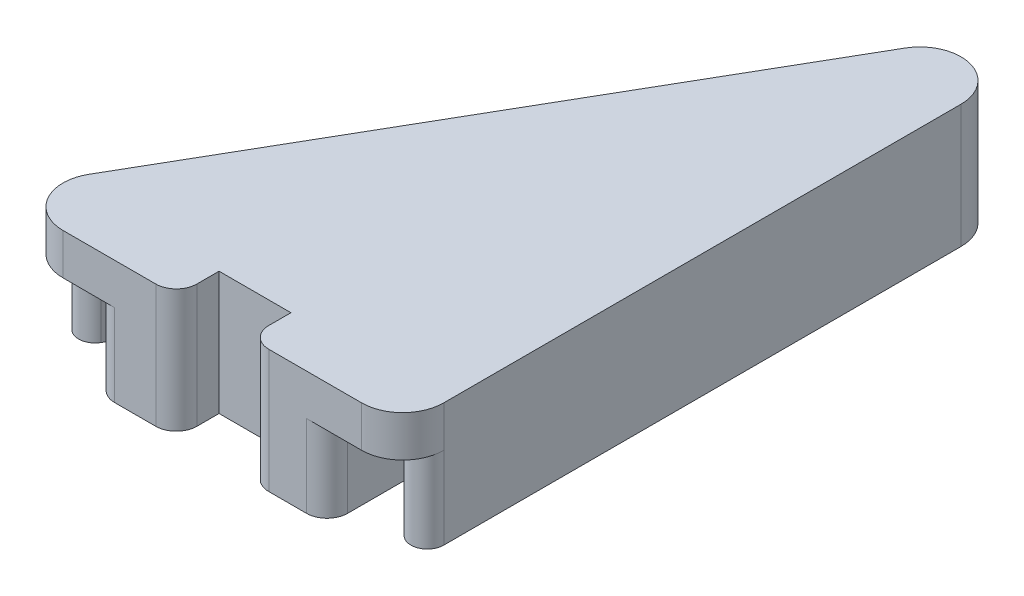
ISO-10303-21;
HEADER;
FILE_DESCRIPTION(('STEP AP214'),'2;1');
FILE_NAME('part.step','',(''),(''),'','','');
FILE_SCHEMA(('AUTOMOTIVE_DESIGN { 1 0 10303 214 1 1 1 1 }'));
ENDSEC;
DATA;
#1=APPLICATION_CONTEXT('core data for automotive mechanical design processes');
#2=APPLICATION_PROTOCOL_DEFINITION('international standard','automotive_design',2000,#1);
#3=PRODUCT_CONTEXT('',#1,'mechanical');
#4=PRODUCT('Part','Part','',(#3));
#5=PRODUCT_RELATED_PRODUCT_CATEGORY('part','',(#4));
#6=PRODUCT_DEFINITION_FORMATION('','',#4);
#7=PRODUCT_DEFINITION_CONTEXT('part definition',#1,'design');
#8=PRODUCT_DEFINITION('design','',#6,#7);
#9=PRODUCT_DEFINITION_SHAPE('','',#8);
#10=(LENGTH_UNIT() NAMED_UNIT(*) SI_UNIT(.MILLI.,.METRE.));
#11=(NAMED_UNIT(*) PLANE_ANGLE_UNIT() SI_UNIT($,.RADIAN.));
#12=(NAMED_UNIT(*) SI_UNIT($,.STERADIAN.) SOLID_ANGLE_UNIT());
#13=UNCERTAINTY_MEASURE_WITH_UNIT(LENGTH_MEASURE(1.E-05),#10,'distance_accuracy_value','');
#14=(GEOMETRIC_REPRESENTATION_CONTEXT(3) GLOBAL_UNCERTAINTY_ASSIGNED_CONTEXT((#13)) GLOBAL_UNIT_ASSIGNED_CONTEXT((#10,
#11,#12)) REPRESENTATION_CONTEXT('',''));
#15=CARTESIAN_POINT('',(0.,0.,0.));
#16=DIRECTION('',(0.,0.,1.));
#17=DIRECTION('',(1.,0.,0.));
#18=AXIS2_PLACEMENT_3D('',#15,#16,#17);
#19=CARTESIAN_POINT('',(-52.5014773719376,19.05,0.));
#20=DIRECTION('',(0.,0.,-1.));
#21=DIRECTION('',(-1.,0.,0.));
#22=AXIS2_PLACEMENT_3D('',#19,#20,#21);
#23=PLANE('',#22);
#24=DIRECTION('',(1.,0.,0.));
#25=VECTOR('',#24,1.);
#26=CARTESIAN_POINT('',(-52.5014773719376,0.,0.));
#27=LINE('',#26,#25);
#28=CARTESIAN_POINT('',(-44.5092175955451,0.,0.));
#29=VERTEX_POINT('',#28);
#30=CARTESIAN_POINT('',(-38.1569886859688,0.,0.));
#31=VERTEX_POINT('',#30);
#32=EDGE_CURVE('E334',#29,#31,#27,.T.);
#33=ORIENTED_EDGE('',*,*,#32,.T.);
#34=DIRECTION('',(0.,1.,0.));
#35=VECTOR('',#34,1.);
#36=CARTESIAN_POINT('',(-38.1569886859688,19.05,0.));
#37=LINE('',#36,#35);
#38=CARTESIAN_POINT('',(-38.1569886859688,19.05,0.));
#39=VERTEX_POINT('',#38);
#40=EDGE_CURVE('E384',#31,#39,#37,.T.);
#41=ORIENTED_EDGE('',*,*,#40,.T.);
#42=DIRECTION('',(1.,0.,0.));
#43=VECTOR('',#42,1.);
#44=CARTESIAN_POINT('',(-52.5014773719376,19.05,0.));
#45=LINE('',#44,#43);
#46=CARTESIAN_POINT('',(-52.5014773719376,19.05,0.));
#47=VERTEX_POINT('',#46);
#48=EDGE_CURVE('E322',#47,#39,#45,.T.);
#49=ORIENTED_EDGE('',*,*,#48,.F.);
#50=DIRECTION('',(0.,-1.,0.));
#51=VECTOR('',#50,1.);
#52=CARTESIAN_POINT('',(-52.5014773719376,19.05,0.));
#53=LINE('',#52,#51);
#54=CARTESIAN_POINT('',(-52.5014773719376,12.7,-2.04697370165263E-13));
#55=VERTEX_POINT('',#54);
#56=EDGE_CURVE('E357',#47,#55,#53,.T.);
#57=ORIENTED_EDGE('',*,*,#56,.T.);
#58=DIRECTION('',(1.,0.,0.));
#59=VECTOR('',#58,1.);
#60=CARTESIAN_POINT('',(-50.0084789095763,12.7,0.));
#61=LINE('',#60,#59);
#62=CARTESIAN_POINT('',(-44.5092175955451,12.7,0.));
#63=VERTEX_POINT('',#62);
#64=EDGE_CURVE('E58',#55,#63,#61,.T.);
#65=ORIENTED_EDGE('',*,*,#64,.T.);
#66=DIRECTION('',(0.,-1.,0.));
#67=VECTOR('',#66,1.);
#68=CARTESIAN_POINT('',(-44.5092175955451,0.,0.));
#69=LINE('',#68,#67);
#70=EDGE_CURVE('E382',#63,#29,#69,.T.);
#71=ORIENTED_EDGE('',*,*,#70,.T.);
#72=EDGE_LOOP('',(#33,#41,#49,#57,#65,#71));
#73=FACE_BOUND('',#72,.T.);
#74=ADVANCED_FACE('F35',(#73),#23,.F.);
#75=CARTESIAN_POINT('',(-20.6944886859688,0.,0.));
#76=VERTEX_POINT('',#75);
#77=CARTESIAN_POINT('',(-14.859,0.,0.));
#78=VERTEX_POINT('',#77);
#79=EDGE_CURVE('E314',#76,#78,#27,.T.);
#80=ORIENTED_EDGE('',*,*,#79,.T.);
#81=DIRECTION('',(0.,-1.,0.));
#82=VECTOR('',#81,1.);
#83=CARTESIAN_POINT('',(-14.859,12.7,0.));
#84=LINE('',#83,#82);
#85=CARTESIAN_POINT('',(-14.859,12.7,0.));
#86=VERTEX_POINT('',#85);
#87=EDGE_CURVE('E372',#78,#86,#84,.F.);
#88=ORIENTED_EDGE('',*,*,#87,.T.);
#89=DIRECTION('',(1.,0.,0.));
#90=VECTOR('',#89,1.);
#91=CARTESIAN_POINT('',(-6.34999999999993,12.7,0.));
#92=LINE('',#91,#90);
#93=CARTESIAN_POINT('',(-6.34999999999993,12.7,0.));
#94=VERTEX_POINT('',#93);
#95=EDGE_CURVE('E251',#86,#94,#92,.T.);
#96=ORIENTED_EDGE('',*,*,#95,.T.);
#97=DIRECTION('',(0.,-1.,0.));
#98=VECTOR('',#97,1.);
#99=CARTESIAN_POINT('',(-6.35000000000004,19.05,0.));
#100=LINE('',#99,#98);
#101=CARTESIAN_POINT('',(-6.35000000000004,19.05,0.));
#102=VERTEX_POINT('',#101);
#103=EDGE_CURVE('E354',#102,#94,#100,.T.);
#104=ORIENTED_EDGE('',*,*,#103,.F.);
#105=CARTESIAN_POINT('',(-20.6944886859688,19.05,0.));
#106=VERTEX_POINT('',#105);
#107=EDGE_CURVE('E320',#106,#102,#45,.T.);
#108=ORIENTED_EDGE('',*,*,#107,.F.);
#109=DIRECTION('',(0.,1.,0.));
#110=VECTOR('',#109,1.);
#111=CARTESIAN_POINT('',(-20.6944886859688,19.05,0.));
#112=LINE('',#111,#110);
#113=EDGE_CURVE('E370',#106,#76,#112,.F.);
#114=ORIENTED_EDGE('',*,*,#113,.T.);
#115=EDGE_LOOP('',(#80,#88,#96,#104,#108,#114));
#116=FACE_BOUND('',#115,.T.);
#117=ADVANCED_FACE('F408',(#116),#23,.F.);
#118=CARTESIAN_POINT('',(-52.5014773719376,0.,-6.34999999999999));
#119=DIRECTION('',(0.,1.,0.));
#120=DIRECTION('',(0.,0.,1.));
#121=AXIS2_PLACEMENT_3D('',#118,#119,#120);
#122=PLANE('',#121);
#123=CARTESIAN_POINT('',(-9.63700187280205,0.,-74.0194456586892));
#124=DIRECTION('',(0.,-1.,0.));
#125=DIRECTION('',(0.,0.,-1.));
#126=AXIS2_PLACEMENT_3D('',#123,#124,#125);
#127=CIRCLE('',#126,1.58749999999999);
#128=CARTESIAN_POINT('',(-9.63700187280205,0.,-75.6069456586892));
#129=VERTEX_POINT('',#128);
#130=EDGE_CURVE('E209',#129,#129,#127,.T.);
#131=ORIENTED_EDGE('',*,*,#130,.F.);
#132=EDGE_LOOP('',(#131));
#133=FACE_BOUND('',#132,.T.);
#134=CARTESIAN_POINT('',(-2.54,0.,-6.35));
#135=DIRECTION('',(0.,-1.,0.));
#136=DIRECTION('',(0.,0.,1.));
#137=AXIS2_PLACEMENT_3D('',#134,#135,#136);
#138=CIRCLE('',#137,2.54);
#139=CARTESIAN_POINT('',(0.,0.,-6.35));
#140=VERTEX_POINT('',#139);
#141=CARTESIAN_POINT('',(-5.08,0.,-6.35));
#142=VERTEX_POINT('',#141);
#143=EDGE_CURVE('E225',#140,#142,#138,.T.);
#144=ORIENTED_EDGE('',*,*,#143,.T.);
#145=DIRECTION('',(0.,0.,-1.));
#146=VECTOR('',#145,1.);
#147=CARTESIAN_POINT('',(-5.08,0.,-45.4453842408075));
#148=LINE('',#147,#146);
#149=CARTESIAN_POINT('',(-5.08,0.,-45.4453842408075));
#150=VERTEX_POINT('',#149);
#151=EDGE_CURVE('E257',#142,#150,#148,.T.);
#152=ORIENTED_EDGE('',*,*,#151,.T.);
#153=CARTESIAN_POINT('',(-17.2933985542007,0.,-45.4453842408075));
#154=DIRECTION('',(0.,1.,0.));
#155=DIRECTION('',(0.,0.,1.));
#156=AXIS2_PLACEMENT_3D('',#153,#154,#155);
#157=CIRCLE('',#156,12.2133985542007);
#158=CARTESIAN_POINT('',(-27.8705119686827,0.,-51.5520835179079));
#159=VERTEX_POINT('',#158);
#160=EDGE_CURVE('E260',#150,#159,#157,.T.);
#161=ORIENTED_EDGE('',*,*,#160,.T.);
#162=DIRECTION('',(-0.5,0.,0.866025403784439));
#163=VECTOR('',#162,1.);
#164=CARTESIAN_POINT('',(-32.1737621498043,0.,-44.0986355665252));
#165=LINE('',#164,#163);
#166=CARTESIAN_POINT('',(-53.6013296347435,0.,-6.98499999999979));
#167=VERTEX_POINT('',#166);
#168=EDGE_CURVE('E263',#159,#167,#165,.T.);
#169=ORIENTED_EDGE('',*,*,#168,.T.);
#170=CARTESIAN_POINT('',(-55.8010341603559,0.,-8.25499999999979));
#171=DIRECTION('',(0.,-1.,0.));
#172=DIRECTION('',(0.,0.,-1.));
#173=AXIS2_PLACEMENT_3D('',#170,#171,#172);
#174=CIRCLE('',#173,2.54);
#175=CARTESIAN_POINT('',(-58.0007386859684,0.,-9.52499999999979));
#176=VERTEX_POINT('',#175);
#177=EDGE_CURVE('E266',#167,#176,#174,.T.);
#178=ORIENTED_EDGE('',*,*,#177,.T.);
#179=DIRECTION('',(-0.500000000000004,0.,0.866025403784436));
#180=VECTOR('',#179,1.);
#181=CARTESIAN_POINT('',(-11.8492613140312,0.,-89.4617036525604));
#182=LINE('',#181,#180);
#183=CARTESIAN_POINT('',(-11.8492613140312,0.,-89.4617036525604));
#184=VERTEX_POINT('',#183);
#185=EDGE_CURVE('E321',#184,#176,#182,.T.);
#186=ORIENTED_EDGE('',*,*,#185,.F.);
#187=CARTESIAN_POINT('',(-6.35,0.,-86.2867036525604));
#188=DIRECTION('',(0.,1.,0.));
#189=DIRECTION('',(0.,0.,1.));
#190=AXIS2_PLACEMENT_3D('',#187,#188,#189);
#191=CIRCLE('',#190,6.35);
#192=CARTESIAN_POINT('',(0.,0.,-86.2867036525604));
#193=VERTEX_POINT('',#192);
#194=EDGE_CURVE('E339',#193,#184,#191,.T.);
#195=ORIENTED_EDGE('',*,*,#194,.F.);
#196=DIRECTION('',(0.,0.,-1.));
#197=VECTOR('',#196,1.);
#198=CARTESIAN_POINT('',(0.,0.,-6.35000000000004));
#199=LINE('',#198,#197);
#200=EDGE_CURVE('E337',#140,#193,#199,.T.);
#201=ORIENTED_EDGE('',*,*,#200,.F.);
#202=EDGE_LOOP('',(#144,#152,#161,#169,#178,#186,#195,#201));
#203=FACE_BOUND('',#202,.T.);
#204=ADVANCED_FACE('F463',(#133,#203),#122,.F.);
#205=CARTESIAN_POINT('',(-18.796,0.,-14.224));
#206=DIRECTION('',(0.,-1.,0.));
#207=DIRECTION('',(0.,0.,-1.));
#208=AXIS2_PLACEMENT_3D('',#205,#206,#207);
#209=CIRCLE('',#208,1.58749999999999);
#210=CARTESIAN_POINT('',(-18.796,0.,-15.8115));
#211=VERTEX_POINT('',#210);
#212=EDGE_CURVE('E208',#211,#211,#209,.T.);
#213=ORIENTED_EDGE('',*,*,#212,.F.);
#214=EDGE_LOOP('',(#213));
#215=FACE_BOUND('',#214,.T.);
#216=CARTESIAN_POINT('',(-34.684248680623,0.,-14.224));
#217=DIRECTION('',(0.,-1.,0.));
#218=DIRECTION('',(0.,0.,-1.));
#219=AXIS2_PLACEMENT_3D('',#216,#217,#218);
#220=CIRCLE('',#219,1.58749999999999);
#221=CARTESIAN_POINT('',(-34.684248680623,0.,-15.8115));
#222=VERTEX_POINT('',#221);
#223=EDGE_CURVE('E219',#222,#222,#220,.T.);
#224=ORIENTED_EDGE('',*,*,#223,.F.);
#225=EDGE_LOOP('',(#224));
#226=FACE_BOUND('',#225,.T.);
#227=DIRECTION('',(0.,0.,1.));
#228=VECTOR('',#227,1.);
#229=CARTESIAN_POINT('',(-11.684,0.,-45.4453842408075));
#230=LINE('',#229,#228);
#231=CARTESIAN_POINT('',(-11.684,0.,-45.4453842408075));
#232=VERTEX_POINT('',#231);
#233=CARTESIAN_POINT('',(-11.684,0.,-3.175));
#234=VERTEX_POINT('',#233);
#235=EDGE_CURVE('E230',#232,#234,#230,.T.);
#236=ORIENTED_EDGE('',*,*,#235,.T.);
#237=CARTESIAN_POINT('',(-14.859,0.,-3.175));
#238=DIRECTION('',(0.,1.,0.));
#239=DIRECTION('',(0.,0.,1.));
#240=AXIS2_PLACEMENT_3D('',#237,#238,#239);
#241=CIRCLE('',#240,3.175);
#242=EDGE_CURVE('E368',#234,#78,#241,.F.);
#243=ORIENTED_EDGE('',*,*,#242,.T.);
#244=ORIENTED_EDGE('',*,*,#79,.F.);
#245=CARTESIAN_POINT('',(-20.6944886859688,0.,-3.175));
#246=DIRECTION('',(0.,1.,0.));
#247=DIRECTION('',(0.,0.,1.));
#248=AXIS2_PLACEMENT_3D('',#245,#246,#247);
#249=CIRCLE('',#248,3.175);
#250=CARTESIAN_POINT('',(-23.8694886859688,0.,-3.175));
#251=VERTEX_POINT('',#250);
#252=EDGE_CURVE('E366',#76,#251,#249,.F.);
#253=ORIENTED_EDGE('',*,*,#252,.T.);
#254=DIRECTION('',(0.,0.,-1.));
#255=VECTOR('',#254,1.);
#256=CARTESIAN_POINT('',(-23.8694886859688,0.,0.));
#257=LINE('',#256,#255);
#258=CARTESIAN_POINT('',(-23.8694886859688,0.,-6.604));
#259=VERTEX_POINT('',#258);
#260=EDGE_CURVE('E299',#251,#259,#257,.T.);
#261=ORIENTED_EDGE('',*,*,#260,.T.);
#262=DIRECTION('',(-1.,0.,0.));
#263=VECTOR('',#262,1.);
#264=CARTESIAN_POINT('',(-34.9819886859688,0.,-6.604));
#265=LINE('',#264,#263);
#266=CARTESIAN_POINT('',(-34.9819886859688,0.,-6.604));
#267=VERTEX_POINT('',#266);
#268=EDGE_CURVE('E302',#259,#267,#265,.T.);
#269=ORIENTED_EDGE('',*,*,#268,.T.);
#270=DIRECTION('',(0.,0.,1.));
#271=VECTOR('',#270,1.);
#272=CARTESIAN_POINT('',(-34.9819886859688,0.,0.));
#273=LINE('',#272,#271);
#274=CARTESIAN_POINT('',(-34.9819886859688,0.,-3.175));
#275=VERTEX_POINT('',#274);
#276=EDGE_CURVE('E296',#267,#275,#273,.T.);
#277=ORIENTED_EDGE('',*,*,#276,.T.);
#278=CARTESIAN_POINT('',(-38.1569886859688,0.,-3.175));
#279=DIRECTION('',(0.,1.,0.));
#280=DIRECTION('',(0.,0.,1.));
#281=AXIS2_PLACEMENT_3D('',#278,#279,#280);
#282=CIRCLE('',#281,3.175);
#283=EDGE_CURVE('E364',#275,#31,#282,.F.);
#284=ORIENTED_EDGE('',*,*,#283,.T.);
#285=ORIENTED_EDGE('',*,*,#32,.F.);
#286=CARTESIAN_POINT('',(-44.5092175955451,0.,-3.175));
#287=DIRECTION('',(0.,1.,0.));
#288=DIRECTION('',(0.,0.,1.));
#289=AXIS2_PLACEMENT_3D('',#286,#287,#288);
#290=CIRCLE('',#289,3.175);
#291=CARTESIAN_POINT('',(-47.2588482525607,0.,-4.7625));
#292=VERTEX_POINT('',#291);
#293=EDGE_CURVE('E362',#29,#292,#290,.F.);
#294=ORIENTED_EDGE('',*,*,#293,.T.);
#295=DIRECTION('',(0.5,0.,-0.866025403784439));
#296=VECTOR('',#295,1.);
#297=CARTESIAN_POINT('',(-22.1512802020902,0.,-48.2500835179079));
#298=LINE('',#297,#296);
#299=CARTESIAN_POINT('',(-22.1512802020902,0.,-48.2500835179079));
#300=VERTEX_POINT('',#299);
#301=EDGE_CURVE('E269',#292,#300,#298,.T.);
#302=ORIENTED_EDGE('',*,*,#301,.T.);
#303=CARTESIAN_POINT('',(-17.2933985542007,0.,-45.4453842408075));
#304=DIRECTION('',(0.,-1.,0.));
#305=DIRECTION('',(0.,0.,-1.));
#306=AXIS2_PLACEMENT_3D('',#303,#304,#305);
#307=CIRCLE('',#306,5.60939855420071);
#308=EDGE_CURVE('E271',#300,#232,#307,.T.);
#309=ORIENTED_EDGE('',*,*,#308,.T.);
#310=EDGE_LOOP('',(#236,#243,#244,#253,#261,#269,#277,#284,#285,#294,#302,#309));
#311=FACE_BOUND('',#310,.T.);
#312=ADVANCED_FACE('F405',(#215,#226,#311),#122,.F.);
#313=CARTESIAN_POINT('',(-52.5014773719376,19.05,-6.34999999999999));
#314=DIRECTION('',(0.,-1.,0.));
#315=DIRECTION('',(0.,0.,-1.));
#316=AXIS2_PLACEMENT_3D('',#313,#314,#315);
#317=CYLINDRICAL_SURFACE('',#316,6.35);
#318=DIRECTION('',(0.,-1.,0.));
#319=VECTOR('',#318,1.);
#320=CARTESIAN_POINT('',(-58.0007386859688,19.05,-9.52500000000002));
#321=LINE('',#320,#319);
#322=CARTESIAN_POINT('',(-58.0007386859688,19.05,-9.52500000000002));
#323=VERTEX_POINT('',#322);
#324=CARTESIAN_POINT('',(-58.0007386859684,12.7,-9.52499999999979));
#325=VERTEX_POINT('',#324);
#326=EDGE_CURVE('E333',#323,#325,#321,.T.);
#327=ORIENTED_EDGE('',*,*,#326,.T.);
#328=CARTESIAN_POINT('',(-52.5014773719376,12.7,-6.34999999999999));
#329=DIRECTION('',(0.,1.,0.));
#330=DIRECTION('',(0.,0.,-1.));
#331=AXIS2_PLACEMENT_3D('',#328,#329,#330);
#332=CIRCLE('',#331,6.34999999999979);
#333=EDGE_CURVE('E240',#325,#55,#332,.T.);
#334=ORIENTED_EDGE('',*,*,#333,.T.);
#335=ORIENTED_EDGE('',*,*,#56,.F.);
#336=CARTESIAN_POINT('',(-52.5014773719376,19.05,-6.34999999999999));
#337=DIRECTION('',(0.,1.,0.));
#338=DIRECTION('',(0.,0.,1.));
#339=AXIS2_PLACEMENT_3D('',#336,#337,#338);
#340=CIRCLE('',#339,6.35);
#341=EDGE_CURVE('E317',#323,#47,#340,.T.);
#342=ORIENTED_EDGE('',*,*,#341,.F.);
#343=EDGE_LOOP('',(#327,#334,#335,#342));
#344=FACE_BOUND('',#343,.T.);
#345=ADVANCED_FACE('F449',(#344),#317,.T.);
#346=CARTESIAN_POINT('',(-6.35,19.05,-6.35));
#347=DIRECTION('',(0.,-1.,0.));
#348=DIRECTION('',(0.,0.,-1.));
#349=AXIS2_PLACEMENT_3D('',#346,#347,#348);
#350=CYLINDRICAL_SURFACE('',#349,6.35);
#351=ORIENTED_EDGE('',*,*,#103,.T.);
#352=CARTESIAN_POINT('',(-6.35,12.7,-6.35));
#353=DIRECTION('',(0.,1.,0.));
#354=DIRECTION('',(0.,0.,1.));
#355=AXIS2_PLACEMENT_3D('',#352,#353,#354);
#356=CIRCLE('',#355,6.35);
#357=CARTESIAN_POINT('',(0.,12.7,-6.35));
#358=VERTEX_POINT('',#357);
#359=EDGE_CURVE('E226',#94,#358,#356,.T.);
#360=ORIENTED_EDGE('',*,*,#359,.T.);
#361=DIRECTION('',(0.,-1.,0.));
#362=VECTOR('',#361,1.);
#363=CARTESIAN_POINT('',(0.,19.05,-6.35000000000004));
#364=LINE('',#363,#362);
#365=CARTESIAN_POINT('',(0.,19.05,-6.35000000000004));
#366=VERTEX_POINT('',#365);
#367=EDGE_CURVE('E351',#366,#358,#364,.T.);
#368=ORIENTED_EDGE('',*,*,#367,.F.);
#369=CARTESIAN_POINT('',(-6.35,19.05,-6.35));
#370=DIRECTION('',(0.,1.,0.));
#371=DIRECTION('',(0.,0.,-1.));
#372=AXIS2_PLACEMENT_3D('',#369,#370,#371);
#373=CIRCLE('',#372,6.35);
#374=EDGE_CURVE('E325',#102,#366,#373,.T.);
#375=ORIENTED_EDGE('',*,*,#374,.F.);
#376=EDGE_LOOP('',(#351,#360,#368,#375));
#377=FACE_BOUND('',#376,.T.);
#378=ADVANCED_FACE('F495',(#377),#350,.T.);
#379=CARTESIAN_POINT('',(0.,19.05,-6.35000000000004));
#380=DIRECTION('',(-1.,0.,0.));
#381=DIRECTION('',(0.,0.,1.));
#382=AXIS2_PLACEMENT_3D('',#379,#380,#381);
#383=PLANE('',#382);
#384=ORIENTED_EDGE('',*,*,#200,.T.);
#385=DIRECTION('',(0.,-1.,0.));
#386=VECTOR('',#385,1.);
#387=CARTESIAN_POINT('',(0.,19.05,-86.2867036525604));
#388=LINE('',#387,#386);
#389=CARTESIAN_POINT('',(0.,19.05,-86.2867036525604));
#390=VERTEX_POINT('',#389);
#391=EDGE_CURVE('E348',#390,#193,#388,.T.);
#392=ORIENTED_EDGE('',*,*,#391,.F.);
#393=DIRECTION('',(0.,0.,-1.));
#394=VECTOR('',#393,1.);
#395=CARTESIAN_POINT('',(0.,19.05,-6.35000000000004));
#396=LINE('',#395,#394);
#397=EDGE_CURVE('E327',#366,#390,#396,.T.);
#398=ORIENTED_EDGE('',*,*,#397,.F.);
#399=ORIENTED_EDGE('',*,*,#367,.T.);
#400=DIRECTION('',(0.,-1.,0.));
#401=VECTOR('',#400,1.);
#402=CARTESIAN_POINT('',(0.,12.7,-6.35));
#403=LINE('',#402,#401);
#404=EDGE_CURVE('E292',#358,#140,#403,.T.);
#405=ORIENTED_EDGE('',*,*,#404,.T.);
#406=EDGE_LOOP('',(#384,#392,#398,#399,#405));
#407=FACE_BOUND('',#406,.T.);
#408=ADVANCED_FACE('F484',(#407),#383,.F.);
#409=CARTESIAN_POINT('',(-6.35,19.05,-86.2867036525604));
#410=DIRECTION('',(0.,-1.,0.));
#411=DIRECTION('',(0.,0.,-1.));
#412=AXIS2_PLACEMENT_3D('',#409,#410,#411);
#413=CYLINDRICAL_SURFACE('',#412,6.35);
#414=ORIENTED_EDGE('',*,*,#194,.T.);
#415=DIRECTION('',(0.,-1.,0.));
#416=VECTOR('',#415,1.);
#417=CARTESIAN_POINT('',(-11.8492613140312,19.05,-89.4617036525604));
#418=LINE('',#417,#416);
#419=CARTESIAN_POINT('',(-11.8492613140312,19.05,-89.4617036525604));
#420=VERTEX_POINT('',#419);
#421=EDGE_CURVE('E345',#420,#184,#418,.T.);
#422=ORIENTED_EDGE('',*,*,#421,.F.);
#423=CARTESIAN_POINT('',(-6.35,19.05,-86.2867036525604));
#424=DIRECTION('',(0.,1.,0.));
#425=DIRECTION('',(0.,0.,1.));
#426=AXIS2_PLACEMENT_3D('',#423,#424,#425);
#427=CIRCLE('',#426,6.35);
#428=EDGE_CURVE('E329',#390,#420,#427,.T.);
#429=ORIENTED_EDGE('',*,*,#428,.F.);
#430=ORIENTED_EDGE('',*,*,#391,.T.);
#431=EDGE_LOOP('',(#414,#422,#429,#430));
#432=FACE_BOUND('',#431,.T.);
#433=ADVANCED_FACE('F487',(#432),#413,.T.);
#434=CARTESIAN_POINT('',(-11.8492613140312,19.05,-89.4617036525604));
#435=DIRECTION('',(0.866025403784436,0.,0.500000000000004));
#436=DIRECTION('',(0.500000000000004,0.,-0.866025403784436));
#437=AXIS2_PLACEMENT_3D('',#434,#435,#436);
#438=PLANE('',#437);
#439=ORIENTED_EDGE('',*,*,#185,.T.);
#440=DIRECTION('',(0.,-1.,0.));
#441=VECTOR('',#440,1.);
#442=CARTESIAN_POINT('',(-58.0007386859684,12.7,-9.52499999999979));
#443=LINE('',#442,#441);
#444=EDGE_CURVE('E280',#325,#176,#443,.T.);
#445=ORIENTED_EDGE('',*,*,#444,.F.);
#446=ORIENTED_EDGE('',*,*,#326,.F.);
#447=DIRECTION('',(-0.500000000000004,0.,0.866025403784436));
#448=VECTOR('',#447,1.);
#449=CARTESIAN_POINT('',(-11.8492613140312,19.05,-89.4617036525604));
#450=LINE('',#449,#448);
#451=EDGE_CURVE('E331',#420,#323,#450,.T.);
#452=ORIENTED_EDGE('',*,*,#451,.F.);
#453=ORIENTED_EDGE('',*,*,#421,.T.);
#454=EDGE_LOOP('',(#439,#445,#446,#452,#453));
#455=FACE_BOUND('',#454,.T.);
#456=ADVANCED_FACE('F456',(#455),#438,.F.);
#457=CARTESIAN_POINT('',(-52.5014773719376,19.05,-6.34999999999999));
#458=DIRECTION('',(0.,1.,0.));
#459=DIRECTION('',(0.,0.,1.));
#460=AXIS2_PLACEMENT_3D('',#457,#458,#459);
#461=PLANE('',#460);
#462=DIRECTION('',(0.,0.,-1.));
#463=VECTOR('',#462,1.);
#464=CARTESIAN_POINT('',(-23.8694886859688,19.05,0.));
#465=LINE('',#464,#463);
#466=CARTESIAN_POINT('',(-23.8694886859688,19.05,-3.175));
#467=VERTEX_POINT('',#466);
#468=CARTESIAN_POINT('',(-23.8694886859688,19.05,-6.604));
#469=VERTEX_POINT('',#468);
#470=EDGE_CURVE('E308',#467,#469,#465,.T.);
#471=ORIENTED_EDGE('',*,*,#470,.F.);
#472=CARTESIAN_POINT('',(-20.6944886859688,19.05,-3.175));
#473=DIRECTION('',(0.,1.,0.));
#474=DIRECTION('',(0.,0.,1.));
#475=AXIS2_PLACEMENT_3D('',#472,#473,#474);
#476=CIRCLE('',#475,3.175);
#477=EDGE_CURVE('E380',#467,#106,#476,.T.);
#478=ORIENTED_EDGE('',*,*,#477,.T.);
#479=ORIENTED_EDGE('',*,*,#107,.T.);
#480=ORIENTED_EDGE('',*,*,#374,.T.);
#481=ORIENTED_EDGE('',*,*,#397,.T.);
#482=ORIENTED_EDGE('',*,*,#428,.T.);
#483=ORIENTED_EDGE('',*,*,#451,.T.);
#484=ORIENTED_EDGE('',*,*,#341,.T.);
#485=ORIENTED_EDGE('',*,*,#48,.T.);
#486=CARTESIAN_POINT('',(-38.1569886859688,19.05,-3.175));
#487=DIRECTION('',(0.,1.,0.));
#488=DIRECTION('',(0.,0.,1.));
#489=AXIS2_PLACEMENT_3D('',#486,#487,#488);
#490=CIRCLE('',#489,3.175);
#491=CARTESIAN_POINT('',(-34.9819886859688,19.05,-3.175));
#492=VERTEX_POINT('',#491);
#493=EDGE_CURVE('E378',#39,#492,#490,.T.);
#494=ORIENTED_EDGE('',*,*,#493,.T.);
#495=DIRECTION('',(0.,0.,1.));
#496=VECTOR('',#495,1.);
#497=CARTESIAN_POINT('',(-34.9819886859688,19.05,0.));
#498=LINE('',#497,#496);
#499=CARTESIAN_POINT('',(-34.9819886859688,19.05,-6.604));
#500=VERTEX_POINT('',#499);
#501=EDGE_CURVE('E295',#500,#492,#498,.T.);
#502=ORIENTED_EDGE('',*,*,#501,.F.);
#503=DIRECTION('',(-1.,0.,0.));
#504=VECTOR('',#503,1.);
#505=CARTESIAN_POINT('',(-34.9819886859688,19.05,-6.604));
#506=LINE('',#505,#504);
#507=EDGE_CURVE('E300',#469,#500,#506,.T.);
#508=ORIENTED_EDGE('',*,*,#507,.F.);
#509=EDGE_LOOP('',(#471,#478,#479,#480,#481,#482,#483,#484,#485,#494,#502,#508));
#510=FACE_BOUND('',#509,.T.);
#511=ADVANCED_FACE('F426',(#510),#461,.T.);
#512=CARTESIAN_POINT('',(-34.9819886859688,0.,0.));
#513=DIRECTION('',(-1.,0.,0.));
#514=DIRECTION('',(0.,0.,1.));
#515=AXIS2_PLACEMENT_3D('',#512,#513,#514);
#516=PLANE('',#515);
#517=ORIENTED_EDGE('',*,*,#501,.T.);
#518=DIRECTION('',(0.,1.,0.));
#519=VECTOR('',#518,1.);
#520=CARTESIAN_POINT('',(-34.9819886859688,0.,-3.175));
#521=LINE('',#520,#519);
#522=EDGE_CURVE('E387',#492,#275,#521,.F.);
#523=ORIENTED_EDGE('',*,*,#522,.T.);
#524=ORIENTED_EDGE('',*,*,#276,.F.);
#525=DIRECTION('',(0.,1.,0.));
#526=VECTOR('',#525,1.);
#527=CARTESIAN_POINT('',(-34.9819886859688,0.,-6.604));
#528=LINE('',#527,#526);
#529=EDGE_CURVE('E312',#267,#500,#528,.T.);
#530=ORIENTED_EDGE('',*,*,#529,.T.);
#531=EDGE_LOOP('',(#517,#523,#524,#530));
#532=FACE_BOUND('',#531,.T.);
#533=ADVANCED_FACE('F429',(#532),#516,.F.);
#534=CARTESIAN_POINT('',(-34.9819886859688,0.,-6.604));
#535=DIRECTION('',(0.,0.,-1.));
#536=DIRECTION('',(-1.,0.,0.));
#537=AXIS2_PLACEMENT_3D('',#534,#535,#536);
#538=PLANE('',#537);
#539=ORIENTED_EDGE('',*,*,#507,.T.);
#540=ORIENTED_EDGE('',*,*,#529,.F.);
#541=ORIENTED_EDGE('',*,*,#268,.F.);
#542=DIRECTION('',(0.,1.,0.));
#543=VECTOR('',#542,1.);
#544=CARTESIAN_POINT('',(-23.8694886859688,0.,-6.604));
#545=LINE('',#544,#543);
#546=EDGE_CURVE('E305',#259,#469,#545,.T.);
#547=ORIENTED_EDGE('',*,*,#546,.T.);
#548=EDGE_LOOP('',(#539,#540,#541,#547));
#549=FACE_BOUND('',#548,.T.);
#550=ADVANCED_FACE('F423',(#549),#538,.F.);
#551=CARTESIAN_POINT('',(-23.8694886859688,0.,0.));
#552=DIRECTION('',(1.,0.,0.));
#553=DIRECTION('',(0.,0.,-1.));
#554=AXIS2_PLACEMENT_3D('',#551,#552,#553);
#555=PLANE('',#554);
#556=ORIENTED_EDGE('',*,*,#260,.F.);
#557=DIRECTION('',(0.,1.,0.));
#558=VECTOR('',#557,1.);
#559=CARTESIAN_POINT('',(-23.8694886859688,0.,-3.175));
#560=LINE('',#559,#558);
#561=EDGE_CURVE('E375',#251,#467,#560,.T.);
#562=ORIENTED_EDGE('',*,*,#561,.T.);
#563=ORIENTED_EDGE('',*,*,#470,.T.);
#564=ORIENTED_EDGE('',*,*,#546,.F.);
#565=EDGE_LOOP('',(#556,#562,#563,#564));
#566=FACE_BOUND('',#565,.T.);
#567=ADVANCED_FACE('F419',(#566),#555,.F.);
#568=CARTESIAN_POINT('',(-2.54,12.7,-6.35));
#569=DIRECTION('',(0.,-1.,0.));
#570=DIRECTION('',(0.,0.,-1.));
#571=AXIS2_PLACEMENT_3D('',#568,#569,#570);
#572=CYLINDRICAL_SURFACE('',#571,2.54);
#573=ORIENTED_EDGE('',*,*,#143,.F.);
#574=ORIENTED_EDGE('',*,*,#404,.F.);
#575=CARTESIAN_POINT('',(-2.54,12.7,-6.35));
#576=DIRECTION('',(0.,-1.,0.));
#577=DIRECTION('',(0.,0.,1.));
#578=AXIS2_PLACEMENT_3D('',#575,#576,#577);
#579=CIRCLE('',#578,2.54);
#580=CARTESIAN_POINT('',(-5.08,12.7,-6.35));
#581=VERTEX_POINT('',#580);
#582=EDGE_CURVE('E229',#358,#581,#579,.T.);
#583=ORIENTED_EDGE('',*,*,#582,.T.);
#584=DIRECTION('',(0.,-1.,0.));
#585=VECTOR('',#584,1.);
#586=CARTESIAN_POINT('',(-5.08,12.7,-6.35));
#587=LINE('',#586,#585);
#588=EDGE_CURVE('E289',#581,#142,#587,.T.);
#589=ORIENTED_EDGE('',*,*,#588,.T.);
#590=EDGE_LOOP('',(#573,#574,#583,#589));
#591=FACE_BOUND('',#590,.T.);
#592=ADVANCED_FACE('F480',(#591),#572,.T.);
#593=CARTESIAN_POINT('',(-5.08,12.7,-45.4453842408075));
#594=DIRECTION('',(-1.,0.,0.));
#595=DIRECTION('',(0.,0.,1.));
#596=AXIS2_PLACEMENT_3D('',#593,#594,#595);
#597=PLANE('',#596);
#598=ORIENTED_EDGE('',*,*,#151,.F.);
#599=ORIENTED_EDGE('',*,*,#588,.F.);
#600=DIRECTION('',(0.,0.,-1.));
#601=VECTOR('',#600,1.);
#602=CARTESIAN_POINT('',(-5.08,12.7,-6.35));
#603=LINE('',#602,#601);
#604=CARTESIAN_POINT('',(-5.08,12.7,-45.4453842408075));
#605=VERTEX_POINT('',#604);
#606=EDGE_CURVE('E232',#581,#605,#603,.T.);
#607=ORIENTED_EDGE('',*,*,#606,.T.);
#608=DIRECTION('',(0.,-1.,0.));
#609=VECTOR('',#608,1.);
#610=CARTESIAN_POINT('',(-5.08,12.7,-45.4453842408075));
#611=LINE('',#610,#609);
#612=EDGE_CURVE('E287',#605,#150,#611,.T.);
#613=ORIENTED_EDGE('',*,*,#612,.T.);
#614=EDGE_LOOP('',(#598,#599,#607,#613));
#615=FACE_BOUND('',#614,.T.);
#616=ADVANCED_FACE('F478',(#615),#597,.T.);
#617=CARTESIAN_POINT('',(-17.2933985542007,12.7,-45.4453842408075));
#618=DIRECTION('',(0.,-1.,0.));
#619=DIRECTION('',(0.,0.,-1.));
#620=AXIS2_PLACEMENT_3D('',#617,#618,#619);
#621=CYLINDRICAL_SURFACE('',#620,12.2133985542007);
#622=ORIENTED_EDGE('',*,*,#160,.F.);
#623=ORIENTED_EDGE('',*,*,#612,.F.);
#624=CARTESIAN_POINT('',(-17.2933985542007,12.7,-45.4453842408075));
#625=DIRECTION('',(0.,1.,0.));
#626=DIRECTION('',(0.,0.,1.));
#627=AXIS2_PLACEMENT_3D('',#624,#625,#626);
#628=CIRCLE('',#627,12.2133985542007);
#629=CARTESIAN_POINT('',(-27.8705119686827,12.7,-51.5520835179079));
#630=VERTEX_POINT('',#629);
#631=EDGE_CURVE('E234',#605,#630,#628,.T.);
#632=ORIENTED_EDGE('',*,*,#631,.T.);
#633=DIRECTION('',(0.,-1.,0.));
#634=VECTOR('',#633,1.);
#635=CARTESIAN_POINT('',(-27.8705119686827,12.7,-51.5520835179079));
#636=LINE('',#635,#634);
#637=EDGE_CURVE('E284',#630,#159,#636,.T.);
#638=ORIENTED_EDGE('',*,*,#637,.T.);
#639=EDGE_LOOP('',(#622,#623,#632,#638));
#640=FACE_BOUND('',#639,.T.);
#641=ADVANCED_FACE('F471',(#640),#621,.F.);
#642=CARTESIAN_POINT('',(-32.1737621498043,12.7,-44.0986355665252));
#643=DIRECTION('',(0.866025403784439,0.,0.5));
#644=DIRECTION('',(0.5,0.,-0.866025403784439));
#645=AXIS2_PLACEMENT_3D('',#642,#643,#644);
#646=PLANE('',#645);
#647=ORIENTED_EDGE('',*,*,#168,.F.);
#648=ORIENTED_EDGE('',*,*,#637,.F.);
#649=DIRECTION('',(-0.500000000000001,0.,0.866025403784438));
#650=VECTOR('',#649,1.);
#651=CARTESIAN_POINT('',(-32.1737621498043,12.7,-44.0986355665252));
#652=LINE('',#651,#650);
#653=CARTESIAN_POINT('',(-53.6013296347435,12.7,-6.98499999999979));
#654=VERTEX_POINT('',#653);
#655=EDGE_CURVE('E236',#630,#654,#652,.T.);
#656=ORIENTED_EDGE('',*,*,#655,.T.);
#657=DIRECTION('',(0.,-1.,0.));
#658=VECTOR('',#657,1.);
#659=CARTESIAN_POINT('',(-53.6013296347435,12.7,-6.98499999999979));
#660=LINE('',#659,#658);
#661=EDGE_CURVE('E282',#654,#167,#660,.T.);
#662=ORIENTED_EDGE('',*,*,#661,.T.);
#663=EDGE_LOOP('',(#647,#648,#656,#662));
#664=FACE_BOUND('',#663,.T.);
#665=ADVANCED_FACE('F468',(#664),#646,.T.);
#666=CARTESIAN_POINT('',(-55.8010341603559,12.7,-8.25499999999979));
#667=DIRECTION('',(0.,-1.,0.));
#668=DIRECTION('',(0.,0.,-1.));
#669=AXIS2_PLACEMENT_3D('',#666,#667,#668);
#670=CYLINDRICAL_SURFACE('',#669,2.54);
#671=ORIENTED_EDGE('',*,*,#177,.F.);
#672=ORIENTED_EDGE('',*,*,#661,.F.);
#673=CARTESIAN_POINT('',(-55.8010341603559,12.7,-8.25499999999979));
#674=DIRECTION('',(0.,-1.,0.));
#675=DIRECTION('',(0.,0.,-1.));
#676=AXIS2_PLACEMENT_3D('',#673,#674,#675);
#677=CIRCLE('',#676,2.54);
#678=EDGE_CURVE('E238',#654,#325,#677,.T.);
#679=ORIENTED_EDGE('',*,*,#678,.T.);
#680=ORIENTED_EDGE('',*,*,#444,.T.);
#681=EDGE_LOOP('',(#671,#672,#679,#680));
#682=FACE_BOUND('',#681,.T.);
#683=ADVANCED_FACE('F460',(#682),#670,.T.);
#684=CARTESIAN_POINT('',(-22.1512802020902,12.7,-48.2500835179079));
#685=DIRECTION('',(-0.866025403784439,0.,-0.5));
#686=DIRECTION('',(-0.5,0.,0.866025403784439));
#687=AXIS2_PLACEMENT_3D('',#684,#685,#686);
#688=PLANE('',#687);
#689=ORIENTED_EDGE('',*,*,#301,.F.);
#690=DIRECTION('',(0.,-1.,0.));
#691=VECTOR('',#690,1.);
#692=CARTESIAN_POINT('',(-47.2588482525607,12.7,-4.7625));
#693=LINE('',#692,#691);
#694=CARTESIAN_POINT('',(-47.2588482525607,12.7,-4.7625));
#695=VERTEX_POINT('',#694);
#696=EDGE_CURVE('E50',#292,#695,#693,.F.);
#697=ORIENTED_EDGE('',*,*,#696,.T.);
#698=DIRECTION('',(0.5,0.,-0.866025403784439));
#699=VECTOR('',#698,1.);
#700=CARTESIAN_POINT('',(-22.1512802020902,12.7,-48.2500835179079));
#701=LINE('',#700,#699);
#702=CARTESIAN_POINT('',(-22.1512802020902,12.7,-48.2500835179079));
#703=VERTEX_POINT('',#702);
#704=EDGE_CURVE('E244',#695,#703,#701,.T.);
#705=ORIENTED_EDGE('',*,*,#704,.T.);
#706=DIRECTION('',(0.,-1.,0.));
#707=VECTOR('',#706,1.);
#708=CARTESIAN_POINT('',(-22.1512802020902,12.7,-48.2500835179079));
#709=LINE('',#708,#707);
#710=EDGE_CURVE('E277',#703,#300,#709,.T.);
#711=ORIENTED_EDGE('',*,*,#710,.T.);
#712=EDGE_LOOP('',(#689,#697,#705,#711));
#713=FACE_BOUND('',#712,.T.);
#714=ADVANCED_FACE('F439',(#713),#688,.T.);
#715=CARTESIAN_POINT('',(-17.2933985542007,12.7,-45.4453842408075));
#716=DIRECTION('',(0.,-1.,0.));
#717=DIRECTION('',(0.,0.,-1.));
#718=AXIS2_PLACEMENT_3D('',#715,#716,#717);
#719=CYLINDRICAL_SURFACE('',#718,5.60939855420071);
#720=ORIENTED_EDGE('',*,*,#308,.F.);
#721=ORIENTED_EDGE('',*,*,#710,.F.);
#722=CARTESIAN_POINT('',(-17.2933985542007,12.7,-45.4453842408075));
#723=DIRECTION('',(0.,-1.,0.));
#724=DIRECTION('',(0.,0.,-1.));
#725=AXIS2_PLACEMENT_3D('',#722,#723,#724);
#726=CIRCLE('',#725,5.60939855420071);
#727=CARTESIAN_POINT('',(-11.684,12.7,-45.4453842408075));
#728=VERTEX_POINT('',#727);
#729=EDGE_CURVE('E246',#703,#728,#726,.T.);
#730=ORIENTED_EDGE('',*,*,#729,.T.);
#731=DIRECTION('',(0.,-1.,0.));
#732=VECTOR('',#731,1.);
#733=CARTESIAN_POINT('',(-11.684,12.7,-45.4453842408075));
#734=LINE('',#733,#732);
#735=EDGE_CURVE('E254',#728,#232,#734,.T.);
#736=ORIENTED_EDGE('',*,*,#735,.T.);
#737=EDGE_LOOP('',(#720,#721,#730,#736));
#738=FACE_BOUND('',#737,.T.);
#739=ADVANCED_FACE('F443',(#738),#719,.T.);
#740=CARTESIAN_POINT('',(-11.684,12.7,-45.4453842408075));
#741=DIRECTION('',(1.,0.,0.));
#742=DIRECTION('',(0.,0.,-1.));
#743=AXIS2_PLACEMENT_3D('',#740,#741,#742);
#744=PLANE('',#743);
#745=DIRECTION('',(0.,0.,1.));
#746=VECTOR('',#745,1.);
#747=CARTESIAN_POINT('',(-11.684,12.7,-45.4453842408075));
#748=LINE('',#747,#746);
#749=CARTESIAN_POINT('',(-11.684,12.7,-3.175));
#750=VERTEX_POINT('',#749);
#751=EDGE_CURVE('E248',#728,#750,#748,.T.);
#752=ORIENTED_EDGE('',*,*,#751,.T.);
#753=DIRECTION('',(0.,-1.,0.));
#754=VECTOR('',#753,1.);
#755=CARTESIAN_POINT('',(-11.684,0.,-3.175));
#756=LINE('',#755,#754);
#757=EDGE_CURVE('E359',#750,#234,#756,.T.);
#758=ORIENTED_EDGE('',*,*,#757,.T.);
#759=ORIENTED_EDGE('',*,*,#235,.F.);
#760=ORIENTED_EDGE('',*,*,#735,.F.);
#761=EDGE_LOOP('',(#752,#758,#759,#760));
#762=FACE_BOUND('',#761,.T.);
#763=ADVANCED_FACE('F399',(#762),#744,.T.);
#764=CARTESIAN_POINT('',(-6.35,12.7,-6.35));
#765=DIRECTION('',(0.,1.,0.));
#766=DIRECTION('',(0.,0.,1.));
#767=AXIS2_PLACEMENT_3D('',#764,#765,#766);
#768=PLANE('',#767);
#769=ORIENTED_EDGE('',*,*,#359,.F.);
#770=ORIENTED_EDGE('',*,*,#95,.F.);
#771=CARTESIAN_POINT('',(-14.859,12.7,-3.175));
#772=DIRECTION('',(0.,1.,0.));
#773=DIRECTION('',(0.,0.,1.));
#774=AXIS2_PLACEMENT_3D('',#771,#772,#773);
#775=CIRCLE('',#774,3.175);
#776=EDGE_CURVE('E43',#86,#750,#775,.T.);
#777=ORIENTED_EDGE('',*,*,#776,.T.);
#778=ORIENTED_EDGE('',*,*,#751,.F.);
#779=ORIENTED_EDGE('',*,*,#729,.F.);
#780=ORIENTED_EDGE('',*,*,#704,.F.);
#781=CARTESIAN_POINT('',(-44.5092175955451,12.7,-3.175));
#782=DIRECTION('',(0.,1.,0.));
#783=DIRECTION('',(0.,0.,1.));
#784=AXIS2_PLACEMENT_3D('',#781,#782,#783);
#785=CIRCLE('',#784,3.175);
#786=EDGE_CURVE('E11',#695,#63,#785,.T.);
#787=ORIENTED_EDGE('',*,*,#786,.T.);
#788=ORIENTED_EDGE('',*,*,#64,.F.);
#789=ORIENTED_EDGE('',*,*,#333,.F.);
#790=ORIENTED_EDGE('',*,*,#678,.F.);
#791=ORIENTED_EDGE('',*,*,#655,.F.);
#792=ORIENTED_EDGE('',*,*,#631,.F.);
#793=ORIENTED_EDGE('',*,*,#606,.F.);
#794=ORIENTED_EDGE('',*,*,#582,.F.);
#795=EDGE_LOOP('',(#769,#770,#777,#778,#779,#780,#787,#788,#789,#790,#791,#792,#793,#794));
#796=FACE_BOUND('',#795,.T.);
#797=ADVANCED_FACE('F392',(#796),#768,.F.);
#798=CARTESIAN_POINT('',(-14.859,12.7,-3.175));
#799=DIRECTION('',(0.,1.,0.));
#800=DIRECTION('',(0.,0.,1.));
#801=AXIS2_PLACEMENT_3D('',#798,#799,#800);
#802=CYLINDRICAL_SURFACE('',#801,3.175);
#803=ORIENTED_EDGE('',*,*,#776,.F.);
#804=ORIENTED_EDGE('',*,*,#87,.F.);
#805=ORIENTED_EDGE('',*,*,#242,.F.);
#806=ORIENTED_EDGE('',*,*,#757,.F.);
#807=EDGE_LOOP('',(#803,#804,#805,#806));
#808=FACE_BOUND('',#807,.T.);
#809=ADVANCED_FACE('F401',(#808),#802,.T.);
#810=CARTESIAN_POINT('',(-20.6944886859688,0.,-3.175));
#811=DIRECTION('',(0.,1.,0.));
#812=DIRECTION('',(0.,0.,1.));
#813=AXIS2_PLACEMENT_3D('',#810,#811,#812);
#814=CYLINDRICAL_SURFACE('',#813,3.175);
#815=ORIENTED_EDGE('',*,*,#252,.F.);
#816=ORIENTED_EDGE('',*,*,#113,.F.);
#817=ORIENTED_EDGE('',*,*,#477,.F.);
#818=ORIENTED_EDGE('',*,*,#561,.F.);
#819=EDGE_LOOP('',(#815,#816,#817,#818));
#820=FACE_BOUND('',#819,.T.);
#821=ADVANCED_FACE('F413',(#820),#814,.T.);
#822=CARTESIAN_POINT('',(-38.1569886859688,19.05,-3.175));
#823=DIRECTION('',(0.,1.,0.));
#824=DIRECTION('',(0.,0.,1.));
#825=AXIS2_PLACEMENT_3D('',#822,#823,#824);
#826=CYLINDRICAL_SURFACE('',#825,3.175);
#827=ORIENTED_EDGE('',*,*,#283,.F.);
#828=ORIENTED_EDGE('',*,*,#522,.F.);
#829=ORIENTED_EDGE('',*,*,#493,.F.);
#830=ORIENTED_EDGE('',*,*,#40,.F.);
#831=EDGE_LOOP('',(#827,#828,#829,#830));
#832=FACE_BOUND('',#831,.T.);
#833=ADVANCED_FACE('F433',(#832),#826,.T.);
#834=CARTESIAN_POINT('',(-44.5092175955451,19.05,-3.175));
#835=DIRECTION('',(0.,1.,0.));
#836=DIRECTION('',(0.,0.,1.));
#837=AXIS2_PLACEMENT_3D('',#834,#835,#836);
#838=CYLINDRICAL_SURFACE('',#837,3.175);
#839=ORIENTED_EDGE('',*,*,#786,.F.);
#840=ORIENTED_EDGE('',*,*,#696,.F.);
#841=ORIENTED_EDGE('',*,*,#293,.F.);
#842=ORIENTED_EDGE('',*,*,#70,.F.);
#843=EDGE_LOOP('',(#839,#840,#841,#842));
#844=FACE_BOUND('',#843,.T.);
#845=ADVANCED_FACE('F37',(#844),#838,.T.);
#846=CARTESIAN_POINT('',(-34.684248680623,11.1252,-14.224));
#847=DIRECTION('',(0.,-1.,0.));
#848=DIRECTION('',(0.,0.,-1.));
#849=AXIS2_PLACEMENT_3D('',#846,#847,#848);
#850=CONICAL_SURFACE('',#849,1.58749999999998,1.02974425867665);
#851=CARTESIAN_POINT('',(-34.684248680623,12.0790662327063,-14.224));
#852=VERTEX_POINT('',#851);
#853=VERTEX_LOOP('',#852);
#854=FACE_BOUND('',#853,.T.);
#855=CARTESIAN_POINT('',(-34.684248680623,11.1252,-14.224));
#856=DIRECTION('',(0.,-1.,0.));
#857=DIRECTION('',(0.,0.,-1.));
#858=AXIS2_PLACEMENT_3D('',#855,#856,#857);
#859=CIRCLE('',#858,1.58749999999998);
#860=CARTESIAN_POINT('',(-34.684248680623,11.1252,-15.8115));
#861=VERTEX_POINT('',#860);
#862=EDGE_CURVE('E222',#861,#861,#859,.T.);
#863=ORIENTED_EDGE('',*,*,#862,.T.);
#864=EDGE_LOOP('',(#863));
#865=FACE_BOUND('',#864,.T.);
#866=ADVANCED_FACE('F513',(#854,#865),#850,.F.);
#867=CARTESIAN_POINT('',(-34.684248680623,0.,-14.224));
#868=DIRECTION('',(0.,-1.,0.));
#869=DIRECTION('',(0.,0.,-1.));
#870=AXIS2_PLACEMENT_3D('',#867,#868,#869);
#871=CYLINDRICAL_SURFACE('',#870,1.58749999999999);
#872=ORIENTED_EDGE('',*,*,#862,.F.);
#873=EDGE_LOOP('',(#872));
#874=FACE_BOUND('',#873,.T.);
#875=ORIENTED_EDGE('',*,*,#223,.T.);
#876=EDGE_LOOP('',(#875));
#877=FACE_BOUND('',#876,.T.);
#878=ADVANCED_FACE('F518',(#874,#877),#871,.F.);
#879=CARTESIAN_POINT('',(-18.796,11.1252,-14.224));
#880=DIRECTION('',(0.,-1.,0.));
#881=DIRECTION('',(0.,0.,-1.));
#882=AXIS2_PLACEMENT_3D('',#879,#880,#881);
#883=CONICAL_SURFACE('',#882,1.58749999999999,1.02974425867665);
#884=CARTESIAN_POINT('',(-18.796,12.0790662327063,-14.224));
#885=VERTEX_POINT('',#884);
#886=VERTEX_LOOP('',#885);
#887=FACE_BOUND('',#886,.T.);
#888=CARTESIAN_POINT('',(-18.796,11.1252,-14.224));
#889=DIRECTION('',(0.,-1.,0.));
#890=DIRECTION('',(0.,0.,-1.));
#891=AXIS2_PLACEMENT_3D('',#888,#889,#890);
#892=CIRCLE('',#891,1.58749999999999);
#893=CARTESIAN_POINT('',(-18.796,11.1252,-15.8115));
#894=VERTEX_POINT('',#893);
#895=EDGE_CURVE('E212',#894,#894,#892,.T.);
#896=ORIENTED_EDGE('',*,*,#895,.T.);
#897=EDGE_LOOP('',(#896));
#898=FACE_BOUND('',#897,.T.);
#899=ADVANCED_FACE('F523',(#887,#898),#883,.F.);
#900=CARTESIAN_POINT('',(-18.796,0.,-14.224));
#901=DIRECTION('',(0.,-1.,0.));
#902=DIRECTION('',(0.,0.,-1.));
#903=AXIS2_PLACEMENT_3D('',#900,#901,#902);
#904=CYLINDRICAL_SURFACE('',#903,1.58749999999999);
#905=ORIENTED_EDGE('',*,*,#895,.F.);
#906=EDGE_LOOP('',(#905));
#907=FACE_BOUND('',#906,.T.);
#908=ORIENTED_EDGE('',*,*,#212,.T.);
#909=EDGE_LOOP('',(#908));
#910=FACE_BOUND('',#909,.T.);
#911=ADVANCED_FACE('F202',(#907,#910),#904,.F.);
#912=CARTESIAN_POINT('',(-9.63700187280205,11.1252,-74.0194456586892));
#913=DIRECTION('',(0.,-1.,0.));
#914=DIRECTION('',(0.,0.,-1.));
#915=AXIS2_PLACEMENT_3D('',#912,#913,#914);
#916=CONICAL_SURFACE('',#915,1.58749999999999,1.02974425867665);
#917=CARTESIAN_POINT('',(-9.63700187280206,12.0790662327063,-74.0194456586892));
#918=VERTEX_POINT('',#917);
#919=VERTEX_LOOP('',#918);
#920=FACE_BOUND('',#919,.T.);
#921=CARTESIAN_POINT('',(-9.63700187280205,11.1252,-74.0194456586892));
#922=DIRECTION('',(0.,-1.,0.));
#923=DIRECTION('',(0.,0.,-1.));
#924=AXIS2_PLACEMENT_3D('',#921,#922,#923);
#925=CIRCLE('',#924,1.58749999999999);
#926=CARTESIAN_POINT('',(-9.63700187280205,11.1252,-75.6069456586892));
#927=VERTEX_POINT('',#926);
#928=EDGE_CURVE('E206',#927,#927,#925,.T.);
#929=ORIENTED_EDGE('',*,*,#928,.T.);
#930=EDGE_LOOP('',(#929));
#931=FACE_BOUND('',#930,.T.);
#932=ADVANCED_FACE('F198',(#920,#931),#916,.F.);
#933=CARTESIAN_POINT('',(-9.63700187280205,0.,-74.0194456586892));
#934=DIRECTION('',(0.,-1.,0.));
#935=DIRECTION('',(0.,0.,-1.));
#936=AXIS2_PLACEMENT_3D('',#933,#934,#935);
#937=CYLINDRICAL_SURFACE('',#936,1.58749999999999);
#938=ORIENTED_EDGE('',*,*,#928,.F.);
#939=EDGE_LOOP('',(#938));
#940=FACE_BOUND('',#939,.T.);
#941=ORIENTED_EDGE('',*,*,#130,.T.);
#942=EDGE_LOOP('',(#941));
#943=FACE_BOUND('',#942,.T.);
#944=ADVANCED_FACE('F201',(#940,#943),#937,.F.);
#945=CLOSED_SHELL('',(#74,#117,#204,#312,#345,#378,#408,#433,#456,#511,#533,#550,#567,#592,#616,
#641,#665,#683,#714,#739,#763,#797,#809,#821,#833,#845,#866,#878,#899,#911,#932,#944));
#946=MANIFOLD_SOLID_BREP('B2',#945);
#947=ADVANCED_BREP_SHAPE_REPRESENTATION('',(#18,#946),#14);
#948=SHAPE_DEFINITION_REPRESENTATION(#9,#947);
ENDSEC;
END-ISO-10303-21;
